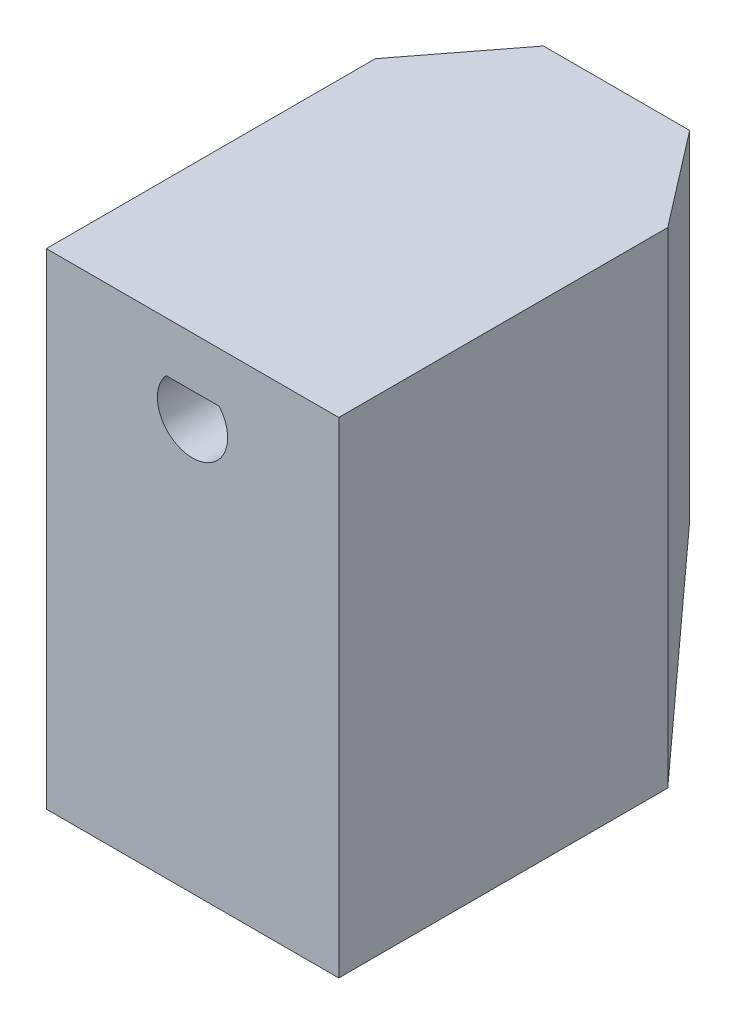
ISO-10303-21;
HEADER;
FILE_DESCRIPTION(('STEP AP214'),'2;1');
FILE_NAME('part.step','',(''),(''),'','','');
FILE_SCHEMA(('AUTOMOTIVE_DESIGN { 1 0 10303 214 1 1 1 1 }'));
ENDSEC;
DATA;
#1=APPLICATION_CONTEXT('core data for automotive mechanical design processes');
#2=APPLICATION_PROTOCOL_DEFINITION('international standard','automotive_design',2000,#1);
#3=PRODUCT_CONTEXT('',#1,'mechanical');
#4=PRODUCT('Part','Part','',(#3));
#5=PRODUCT_RELATED_PRODUCT_CATEGORY('part','',(#4));
#6=PRODUCT_DEFINITION_FORMATION('','',#4);
#7=PRODUCT_DEFINITION_CONTEXT('part definition',#1,'design');
#8=PRODUCT_DEFINITION('design','',#6,#7);
#9=PRODUCT_DEFINITION_SHAPE('','',#8);
#10=(LENGTH_UNIT() NAMED_UNIT(*) SI_UNIT(.MILLI.,.METRE.));
#11=(NAMED_UNIT(*) PLANE_ANGLE_UNIT() SI_UNIT($,.RADIAN.));
#12=(NAMED_UNIT(*) SI_UNIT($,.STERADIAN.) SOLID_ANGLE_UNIT());
#13=UNCERTAINTY_MEASURE_WITH_UNIT(LENGTH_MEASURE(1.E-05),#10,'distance_accuracy_value','');
#14=(GEOMETRIC_REPRESENTATION_CONTEXT(3) GLOBAL_UNCERTAINTY_ASSIGNED_CONTEXT((#13)) GLOBAL_UNIT_ASSIGNED_CONTEXT((#10,
#11,#12)) REPRESENTATION_CONTEXT('',''));
#15=CARTESIAN_POINT('',(0.,0.,0.));
#16=DIRECTION('',(0.,0.,1.));
#17=DIRECTION('',(1.,0.,0.));
#18=AXIS2_PLACEMENT_3D('',#15,#16,#17);
#19=CARTESIAN_POINT('',(12.7,0.,25.4));
#20=DIRECTION('',(1.,0.,0.));
#21=DIRECTION('',(0.,1.,0.));
#22=AXIS2_PLACEMENT_3D('',#19,#20,#21);
#23=PLANE('',#22);
#24=DIRECTION('',(0.,-1.,0.));
#25=VECTOR('',#24,1.);
#26=CARTESIAN_POINT('',(12.7,6.351,-3.175));
#27=LINE('',#26,#25);
#28=CARTESIAN_POINT('',(12.7,6.35,-3.175));
#29=VERTEX_POINT('',#28);
#30=CARTESIAN_POINT('',(12.7,-35.814,-3.175));
#31=VERTEX_POINT('',#30);
#32=EDGE_CURVE('E183',#29,#31,#27,.T.);
#33=ORIENTED_EDGE('',*,*,#32,.F.);
#34=DIRECTION('',(0.,0.,1.));
#35=VECTOR('',#34,1.);
#36=CARTESIAN_POINT('',(12.7,6.35,-11.43));
#37=LINE('',#36,#35);
#38=CARTESIAN_POINT('',(12.7,6.35,25.4));
#39=VERTEX_POINT('',#38);
#40=EDGE_CURVE('E59',#29,#39,#37,.T.);
#41=ORIENTED_EDGE('',*,*,#40,.T.);
#42=DIRECTION('',(0.,-1.,0.));
#43=VECTOR('',#42,1.);
#44=CARTESIAN_POINT('',(12.7,0.,25.4));
#45=LINE('',#44,#43);
#46=CARTESIAN_POINT('',(12.7,-35.814,25.4));
#47=VERTEX_POINT('',#46);
#48=EDGE_CURVE('E171',#39,#47,#45,.T.);
#49=ORIENTED_EDGE('',*,*,#48,.T.);
#50=DIRECTION('',(0.,0.,-1.));
#51=VECTOR('',#50,1.);
#52=CARTESIAN_POINT('',(12.7,-35.814,25.4));
#53=LINE('',#52,#51);
#54=EDGE_CURVE('E52',#47,#31,#53,.T.);
#55=ORIENTED_EDGE('',*,*,#54,.T.);
#56=EDGE_LOOP('',(#33,#41,#49,#55));
#57=FACE_BOUND('',#56,.T.);
#58=ADVANCED_FACE('F44',(#57),#23,.T.);
#59=CARTESIAN_POINT('',(0.,6.35,25.4));
#60=DIRECTION('',(0.,1.,0.));
#61=DIRECTION('',(-1.,0.,0.));
#62=AXIS2_PLACEMENT_3D('',#59,#60,#61);
#63=PLANE('',#62);
#64=DIRECTION('',(0.,0.,1.));
#65=VECTOR('',#64,1.);
#66=CARTESIAN_POINT('',(-12.7,6.35,-11.43));
#67=LINE('',#66,#65);
#68=CARTESIAN_POINT('',(-12.7,6.35,-3.175));
#69=VERTEX_POINT('',#68);
#70=CARTESIAN_POINT('',(-12.7,6.35,25.4));
#71=VERTEX_POINT('',#70);
#72=EDGE_CURVE('E149',#69,#71,#67,.T.);
#73=ORIENTED_EDGE('',*,*,#72,.T.);
#74=DIRECTION('',(1.,0.,0.));
#75=VECTOR('',#74,1.);
#76=CARTESIAN_POINT('',(0.,6.35,25.4));
#77=LINE('',#76,#75);
#78=EDGE_CURVE('E153',#71,#39,#77,.T.);
#79=ORIENTED_EDGE('',*,*,#78,.T.);
#80=ORIENTED_EDGE('',*,*,#40,.F.);
#81=DIRECTION('',(-0.609710760849693,0.,-0.7926239891046));
#82=VECTOR('',#81,1.);
#83=CARTESIAN_POINT('',(6.35,6.35,-11.43));
#84=LINE('',#83,#82);
#85=CARTESIAN_POINT('',(6.35,6.35,-11.43));
#86=VERTEX_POINT('',#85);
#87=EDGE_CURVE('E517',#29,#86,#84,.T.);
#88=ORIENTED_EDGE('',*,*,#87,.T.);
#89=DIRECTION('',(1.,0.,0.));
#90=VECTOR('',#89,1.);
#91=CARTESIAN_POINT('',(12.7,6.35,-11.43));
#92=LINE('',#91,#90);
#93=CARTESIAN_POINT('',(-6.35,6.35,-11.43));
#94=VERTEX_POINT('',#93);
#95=EDGE_CURVE('E193',#94,#86,#92,.T.);
#96=ORIENTED_EDGE('',*,*,#95,.F.);
#97=DIRECTION('',(-0.609710760849693,0.,0.7926239891046));
#98=VECTOR('',#97,1.);
#99=CARTESIAN_POINT('',(-12.7,6.35,-3.175));
#100=LINE('',#99,#98);
#101=EDGE_CURVE('E155',#94,#69,#100,.T.);
#102=ORIENTED_EDGE('',*,*,#101,.T.);
#103=EDGE_LOOP('',(#73,#79,#80,#88,#96,#102));
#104=FACE_BOUND('',#103,.T.);
#105=ADVANCED_FACE('F151',(#104),#63,.T.);
#106=CARTESIAN_POINT('',(-12.7,0.,25.4));
#107=DIRECTION('',(1.,0.,0.));
#108=DIRECTION('',(0.,1.,0.));
#109=AXIS2_PLACEMENT_3D('',#106,#107,#108);
#110=PLANE('',#109);
#111=ORIENTED_EDGE('',*,*,#72,.F.);
#112=DIRECTION('',(0.,-1.,0.));
#113=VECTOR('',#112,1.);
#114=CARTESIAN_POINT('',(-12.7,6.351,-3.175));
#115=LINE('',#114,#113);
#116=CARTESIAN_POINT('',(-12.7,-35.814,-3.175));
#117=VERTEX_POINT('',#116);
#118=EDGE_CURVE('E508',#69,#117,#115,.T.);
#119=ORIENTED_EDGE('',*,*,#118,.T.);
#120=DIRECTION('',(0.,0.,-1.));
#121=VECTOR('',#120,1.);
#122=CARTESIAN_POINT('',(-12.7,-35.814,25.4));
#123=LINE('',#122,#121);
#124=CARTESIAN_POINT('',(-12.7,-35.814,25.4));
#125=VERTEX_POINT('',#124);
#126=EDGE_CURVE('E13',#125,#117,#123,.T.);
#127=ORIENTED_EDGE('',*,*,#126,.F.);
#128=DIRECTION('',(0.,-1.,0.));
#129=VECTOR('',#128,1.);
#130=CARTESIAN_POINT('',(-12.7,0.,25.4));
#131=LINE('',#130,#129);
#132=EDGE_CURVE('E162',#71,#125,#131,.T.);
#133=ORIENTED_EDGE('',*,*,#132,.F.);
#134=EDGE_LOOP('',(#111,#119,#127,#133));
#135=FACE_BOUND('',#134,.T.);
#136=ADVANCED_FACE('F163',(#135),#110,.F.);
#137=CARTESIAN_POINT('',(0.,-35.814,25.4));
#138=DIRECTION('',(0.,1.,0.));
#139=DIRECTION('',(0.,0.,1.));
#140=AXIS2_PLACEMENT_3D('',#137,#138,#139);
#141=PLANE('',#140);
#142=DIRECTION('',(0.,0.,1.));
#143=VECTOR('',#142,1.);
#144=CARTESIAN_POINT('',(9.525,-35.814,22.225));
#145=LINE('',#144,#143);
#146=CARTESIAN_POINT('',(9.525,-35.814,3.175));
#147=VERTEX_POINT('',#146);
#148=CARTESIAN_POINT('',(9.525,-35.814,22.225));
#149=VERTEX_POINT('',#148);
#150=EDGE_CURVE('E455',#147,#149,#145,.T.);
#151=ORIENTED_EDGE('',*,*,#150,.F.);
#152=DIRECTION('',(1.,0.,0.));
#153=VECTOR('',#152,1.);
#154=CARTESIAN_POINT('',(-9.525,-35.814,3.175));
#155=LINE('',#154,#153);
#156=CARTESIAN_POINT('',(-9.525,-35.814,3.175));
#157=VERTEX_POINT('',#156);
#158=EDGE_CURVE('E451',#157,#147,#155,.T.);
#159=ORIENTED_EDGE('',*,*,#158,.F.);
#160=DIRECTION('',(0.,0.,-1.));
#161=VECTOR('',#160,1.);
#162=CARTESIAN_POINT('',(-9.525,-35.814,22.225));
#163=LINE('',#162,#161);
#164=CARTESIAN_POINT('',(-9.525,-35.814,22.225));
#165=VERTEX_POINT('',#164);
#166=EDGE_CURVE('E441',#165,#157,#163,.T.);
#167=ORIENTED_EDGE('',*,*,#166,.F.);
#168=DIRECTION('',(-1.,0.,0.));
#169=VECTOR('',#168,1.);
#170=CARTESIAN_POINT('',(-9.525,-35.814,22.225));
#171=LINE('',#170,#169);
#172=EDGE_CURVE('E67',#149,#165,#171,.T.);
#173=ORIENTED_EDGE('',*,*,#172,.F.);
#174=EDGE_LOOP('',(#151,#159,#167,#173));
#175=FACE_BOUND('',#174,.T.);
#176=ORIENTED_EDGE('',*,*,#126,.T.);
#177=DIRECTION('',(1.,0.,0.));
#178=VECTOR('',#177,1.);
#179=CARTESIAN_POINT('',(-14.2885,-35.814,-3.175));
#180=LINE('',#179,#178);
#181=EDGE_CURVE('E188',#117,#31,#180,.T.);
#182=ORIENTED_EDGE('',*,*,#181,.T.);
#183=ORIENTED_EDGE('',*,*,#54,.F.);
#184=DIRECTION('',(1.,0.,0.));
#185=VECTOR('',#184,1.);
#186=CARTESIAN_POINT('',(0.,-35.814,25.4));
#187=LINE('',#186,#185);
#188=EDGE_CURVE('E167',#125,#47,#187,.T.);
#189=ORIENTED_EDGE('',*,*,#188,.F.);
#190=EDGE_LOOP('',(#176,#182,#183,#189));
#191=FACE_BOUND('',#190,.T.);
#192=ADVANCED_FACE('F186',(#175,#191),#141,.F.);
#193=CARTESIAN_POINT('',(0.,0.,25.4));
#194=DIRECTION('',(0.,0.,1.));
#195=DIRECTION('',(1.,0.,0.));
#196=AXIS2_PLACEMENT_3D('',#193,#194,#195);
#197=PLANE('',#196);
#198=ORIENTED_EDGE('',*,*,#78,.F.);
#199=ORIENTED_EDGE('',*,*,#132,.T.);
#200=ORIENTED_EDGE('',*,*,#188,.T.);
#201=ORIENTED_EDGE('',*,*,#48,.F.);
#202=EDGE_LOOP('',(#198,#199,#200,#201));
#203=FACE_BOUND('',#202,.T.);
#204=CARTESIAN_POINT('',(0.,0.,25.4));
#205=DIRECTION('',(0.,0.,1.));
#206=DIRECTION('',(1.,0.,0.));
#207=AXIS2_PLACEMENT_3D('',#204,#205,#206);
#208=CIRCLE('',#207,3.05);
#209=CARTESIAN_POINT('',(-2.3,2.00312256240101,25.4));
#210=VERTEX_POINT('',#209);
#211=CARTESIAN_POINT('',(2.3,2.00312256240101,25.4));
#212=VERTEX_POINT('',#211);
#213=EDGE_CURVE('E159',#210,#212,#208,.T.);
#214=ORIENTED_EDGE('',*,*,#213,.F.);
#215=DIRECTION('',(-1.,0.,0.));
#216=VECTOR('',#215,1.);
#217=CARTESIAN_POINT('',(-2.3,2.00312256240101,25.4));
#218=LINE('',#217,#216);
#219=EDGE_CURVE('E212',#212,#210,#218,.T.);
#220=ORIENTED_EDGE('',*,*,#219,.F.);
#221=EDGE_LOOP('',(#214,#220));
#222=FACE_BOUND('',#221,.T.);
#223=ADVANCED_FACE('F169',(#203,#222),#197,.T.);
#224=CARTESIAN_POINT('',(0.,0.,15.9));
#225=DIRECTION('',(0.,0.,1.));
#226=DIRECTION('',(1.,0.,0.));
#227=AXIS2_PLACEMENT_3D('',#224,#225,#226);
#228=CYLINDRICAL_SURFACE('',#227,3.05);
#229=ORIENTED_EDGE('',*,*,#213,.T.);
#230=DIRECTION('',(0.,0.,1.));
#231=VECTOR('',#230,1.);
#232=CARTESIAN_POINT('',(2.3,2.00312256240101,15.9));
#233=LINE('',#232,#231);
#234=CARTESIAN_POINT('',(2.3,2.00312256240101,15.9));
#235=VERTEX_POINT('',#234);
#236=EDGE_CURVE('E216',#235,#212,#233,.T.);
#237=ORIENTED_EDGE('',*,*,#236,.F.);
#238=CARTESIAN_POINT('',(0.,0.,15.9));
#239=DIRECTION('',(0.,0.,1.));
#240=DIRECTION('',(1.,0.,0.));
#241=AXIS2_PLACEMENT_3D('',#238,#239,#240);
#242=CIRCLE('',#241,3.05);
#243=CARTESIAN_POINT('',(-2.3,2.00312256240101,15.9));
#244=VERTEX_POINT('',#243);
#245=EDGE_CURVE('E207',#244,#235,#242,.T.);
#246=ORIENTED_EDGE('',*,*,#245,.F.);
#247=DIRECTION('',(0.,0.,1.));
#248=VECTOR('',#247,1.);
#249=CARTESIAN_POINT('',(-2.3,2.00312256240101,15.9));
#250=LINE('',#249,#248);
#251=EDGE_CURVE('E175',#244,#210,#250,.T.);
#252=ORIENTED_EDGE('',*,*,#251,.T.);
#253=EDGE_LOOP('',(#229,#237,#246,#252));
#254=FACE_BOUND('',#253,.T.);
#255=ADVANCED_FACE('F232',(#254),#228,.F.);
#256=CARTESIAN_POINT('',(-2.3,2.00312256240101,15.9));
#257=DIRECTION('',(0.,1.,0.));
#258=DIRECTION('',(0.,0.,1.));
#259=AXIS2_PLACEMENT_3D('',#256,#257,#258);
#260=PLANE('',#259);
#261=ORIENTED_EDGE('',*,*,#219,.T.);
#262=ORIENTED_EDGE('',*,*,#251,.F.);
#263=DIRECTION('',(-1.,0.,0.));
#264=VECTOR('',#263,1.);
#265=CARTESIAN_POINT('',(-2.3,2.00312256240101,15.9));
#266=LINE('',#265,#264);
#267=EDGE_CURVE('E211',#235,#244,#266,.T.);
#268=ORIENTED_EDGE('',*,*,#267,.F.);
#269=ORIENTED_EDGE('',*,*,#236,.T.);
#270=EDGE_LOOP('',(#261,#262,#268,#269));
#271=FACE_BOUND('',#270,.T.);
#272=ADVANCED_FACE('F228',(#271),#260,.F.);
#273=CARTESIAN_POINT('',(0.,0.,15.9));
#274=DIRECTION('',(0.,0.,1.));
#275=DIRECTION('',(1.,0.,0.));
#276=AXIS2_PLACEMENT_3D('',#273,#274,#275);
#277=PLANE('',#276);
#278=ORIENTED_EDGE('',*,*,#245,.T.);
#279=ORIENTED_EDGE('',*,*,#267,.T.);
#280=EDGE_LOOP('',(#278,#279));
#281=FACE_BOUND('',#280,.T.);
#282=ADVANCED_FACE('F234',(#281),#277,.T.);
#283=CARTESIAN_POINT('',(0.,0.,-11.43));
#284=DIRECTION('',(0.,0.,-1.));
#285=DIRECTION('',(-1.,0.,0.));
#286=AXIS2_PLACEMENT_3D('',#283,#284,#285);
#287=PLANE('',#286);
#288=CARTESIAN_POINT('',(0.,0.,-11.43));
#289=DIRECTION('',(0.,0.,-1.));
#290=DIRECTION('',(-1.,0.,0.));
#291=AXIS2_PLACEMENT_3D('',#288,#289,#290);
#292=CIRCLE('',#291,3.302);
#293=CARTESIAN_POINT('',(1.651,2.85961588329622,-11.43));
#294=VERTEX_POINT('',#293);
#295=CARTESIAN_POINT('',(-1.651,2.85961588329622,-11.43));
#296=VERTEX_POINT('',#295);
#297=EDGE_CURVE('E480',#294,#296,#292,.T.);
#298=ORIENTED_EDGE('',*,*,#297,.F.);
#299=DIRECTION('',(1.,0.,0.));
#300=VECTOR('',#299,1.);
#301=CARTESIAN_POINT('',(1.651,2.85961588329622,-11.43));
#302=LINE('',#301,#300);
#303=EDGE_CURVE('E486',#296,#294,#302,.T.);
#304=ORIENTED_EDGE('',*,*,#303,.F.);
#305=EDGE_LOOP('',(#298,#304));
#306=FACE_BOUND('',#305,.T.);
#307=DIRECTION('',(0.,-1.,0.));
#308=VECTOR('',#307,1.);
#309=CARTESIAN_POINT('',(-6.35,6.351,-11.43));
#310=LINE('',#309,#308);
#311=CARTESIAN_POINT('',(-6.35,-23.01875,-11.43));
#312=VERTEX_POINT('',#311);
#313=EDGE_CURVE('E506',#94,#312,#310,.T.);
#314=ORIENTED_EDGE('',*,*,#313,.F.);
#315=ORIENTED_EDGE('',*,*,#95,.T.);
#316=DIRECTION('',(0.,-1.,0.));
#317=VECTOR('',#316,1.);
#318=CARTESIAN_POINT('',(6.35,6.351,-11.43));
#319=LINE('',#318,#317);
#320=CARTESIAN_POINT('',(6.35,-23.01875,-11.43));
#321=VERTEX_POINT('',#320);
#322=EDGE_CURVE('E507',#86,#321,#319,.T.);
#323=ORIENTED_EDGE('',*,*,#322,.T.);
#324=DIRECTION('',(1.,0.,0.));
#325=VECTOR('',#324,1.);
#326=CARTESIAN_POINT('',(-14.2885,-23.01875,-11.43));
#327=LINE('',#326,#325);
#328=EDGE_CURVE('E194',#312,#321,#327,.T.);
#329=ORIENTED_EDGE('',*,*,#328,.F.);
#330=EDGE_LOOP('',(#314,#315,#323,#329));
#331=FACE_BOUND('',#330,.T.);
#332=ADVANCED_FACE('F236',(#306,#331),#287,.T.);
#333=CARTESIAN_POINT('',(-14.2885,-35.814,-3.175));
#334=DIRECTION('',(0.,0.542126869822093,0.840296648224244));
#335=DIRECTION('',(0.,-0.840296648224244,0.542126869822093));
#336=AXIS2_PLACEMENT_3D('',#333,#334,#335);
#337=PLANE('',#336);
#338=ORIENTED_EDGE('',*,*,#181,.F.);
#339=DIRECTION('',(-0.38489376461713,-0.775560935703517,0.500361894002269));
#340=VECTOR('',#339,1.);
#341=CARTESIAN_POINT('',(-0.113386220459314,-10.4519732342255,-19.5375979134029));
#342=LINE('',#341,#340);
#343=EDGE_CURVE('E503',#312,#117,#342,.T.);
#344=ORIENTED_EDGE('',*,*,#343,.F.);
#345=ORIENTED_EDGE('',*,*,#328,.T.);
#346=DIRECTION('',(-0.384893764617131,0.775560935703517,-0.500361894002269));
#347=VECTOR('',#346,1.);
#348=CARTESIAN_POINT('',(-2.41712202185854,-5.35299912595507,-22.8272586284161));
#349=LINE('',#348,#347);
#350=EDGE_CURVE('E499',#31,#321,#349,.T.);
#351=ORIENTED_EDGE('',*,*,#350,.F.);
#352=EDGE_LOOP('',(#338,#344,#345,#351));
#353=FACE_BOUND('',#352,.T.);
#354=ADVANCED_FACE('F242',(#353),#337,.F.);
#355=CARTESIAN_POINT('',(6.35,6.351,-11.43));
#356=DIRECTION('',(-0.7926239891046,0.,0.609710760849693));
#357=DIRECTION('',(0.609710760849693,0.,0.7926239891046));
#358=AXIS2_PLACEMENT_3D('',#355,#356,#357);
#359=PLANE('',#358);
#360=ORIENTED_EDGE('',*,*,#32,.T.);
#361=ORIENTED_EDGE('',*,*,#350,.T.);
#362=ORIENTED_EDGE('',*,*,#322,.F.);
#363=ORIENTED_EDGE('',*,*,#87,.F.);
#364=EDGE_LOOP('',(#360,#361,#362,#363));
#365=FACE_BOUND('',#364,.T.);
#366=ADVANCED_FACE('F283',(#365),#359,.F.);
#367=CARTESIAN_POINT('',(-12.7,6.351,-3.175));
#368=DIRECTION('',(0.7926239891046,0.,0.609710760849693));
#369=DIRECTION('',(0.609710760849693,0.,-0.7926239891046));
#370=AXIS2_PLACEMENT_3D('',#367,#368,#369);
#371=PLANE('',#370);
#372=ORIENTED_EDGE('',*,*,#313,.T.);
#373=ORIENTED_EDGE('',*,*,#343,.T.);
#374=ORIENTED_EDGE('',*,*,#118,.F.);
#375=ORIENTED_EDGE('',*,*,#101,.F.);
#376=EDGE_LOOP('',(#372,#373,#374,#375));
#377=FACE_BOUND('',#376,.T.);
#378=ADVANCED_FACE('F293',(#377),#371,.F.);
#379=CARTESIAN_POINT('',(0.,0.,8.57));
#380=DIRECTION('',(0.,0.,-1.));
#381=DIRECTION('',(-1.,0.,0.));
#382=AXIS2_PLACEMENT_3D('',#379,#380,#381);
#383=CYLINDRICAL_SURFACE('',#382,3.302);
#384=ORIENTED_EDGE('',*,*,#297,.T.);
#385=DIRECTION('',(0.,0.,-1.));
#386=VECTOR('',#385,1.);
#387=CARTESIAN_POINT('',(-1.651,2.85961588329622,8.57));
#388=LINE('',#387,#386);
#389=CARTESIAN_POINT('',(-1.651,2.85961588329622,8.57));
#390=VERTEX_POINT('',#389);
#391=EDGE_CURVE('E490',#390,#296,#388,.T.);
#392=ORIENTED_EDGE('',*,*,#391,.F.);
#393=CARTESIAN_POINT('',(0.,0.,8.57));
#394=DIRECTION('',(0.,0.,-1.));
#395=DIRECTION('',(-1.,0.,0.));
#396=AXIS2_PLACEMENT_3D('',#393,#394,#395);
#397=CIRCLE('',#396,3.302);
#398=CARTESIAN_POINT('',(1.651,2.85961588329622,8.57));
#399=VERTEX_POINT('',#398);
#400=EDGE_CURVE('E481',#399,#390,#397,.T.);
#401=ORIENTED_EDGE('',*,*,#400,.F.);
#402=DIRECTION('',(0.,0.,-1.));
#403=VECTOR('',#402,1.);
#404=CARTESIAN_POINT('',(1.651,2.85961588329622,8.57));
#405=LINE('',#404,#403);
#406=EDGE_CURVE('E496',#399,#294,#405,.T.);
#407=ORIENTED_EDGE('',*,*,#406,.T.);
#408=EDGE_LOOP('',(#384,#392,#401,#407));
#409=FACE_BOUND('',#408,.T.);
#410=ADVANCED_FACE('F303',(#409),#383,.F.);
#411=CARTESIAN_POINT('',(1.651,2.85961588329622,8.57));
#412=DIRECTION('',(0.,1.,0.));
#413=DIRECTION('',(0.,0.,1.));
#414=AXIS2_PLACEMENT_3D('',#411,#412,#413);
#415=PLANE('',#414);
#416=ORIENTED_EDGE('',*,*,#303,.T.);
#417=ORIENTED_EDGE('',*,*,#406,.F.);
#418=DIRECTION('',(1.,0.,0.));
#419=VECTOR('',#418,1.);
#420=CARTESIAN_POINT('',(1.651,2.85961588329622,8.57));
#421=LINE('',#420,#419);
#422=EDGE_CURVE('E485',#390,#399,#421,.T.);
#423=ORIENTED_EDGE('',*,*,#422,.F.);
#424=ORIENTED_EDGE('',*,*,#391,.T.);
#425=EDGE_LOOP('',(#416,#417,#423,#424));
#426=FACE_BOUND('',#425,.T.);
#427=ADVANCED_FACE('F319',(#426),#415,.F.);
#428=CARTESIAN_POINT('',(0.,0.,8.57));
#429=DIRECTION('',(0.,0.,-1.));
#430=DIRECTION('',(-1.,0.,0.));
#431=AXIS2_PLACEMENT_3D('',#428,#429,#430);
#432=PLANE('',#431);
#433=ORIENTED_EDGE('',*,*,#400,.T.);
#434=ORIENTED_EDGE('',*,*,#422,.T.);
#435=EDGE_LOOP('',(#433,#434));
#436=FACE_BOUND('',#435,.T.);
#437=ADVANCED_FACE('F329',(#436),#432,.T.);
#438=CARTESIAN_POINT('',(0.,-9.52499999999996,25.4));
#439=DIRECTION('',(0.,1.,0.));
#440=DIRECTION('',(-1.,0.,0.));
#441=AXIS2_PLACEMENT_3D('',#438,#439,#440);
#442=PLANE('',#441);
#443=DIRECTION('',(0.,0.,-1.));
#444=VECTOR('',#443,1.);
#445=CARTESIAN_POINT('',(-9.525,-9.52499999999993,22.225));
#446=LINE('',#445,#444);
#447=CARTESIAN_POINT('',(-9.525,-9.52499999999993,22.225));
#448=VERTEX_POINT('',#447);
#449=CARTESIAN_POINT('',(-9.525,-9.52499999999993,3.175));
#450=VERTEX_POINT('',#449);
#451=EDGE_CURVE('E444',#448,#450,#446,.T.);
#452=ORIENTED_EDGE('',*,*,#451,.T.);
#453=DIRECTION('',(1.,0.,0.));
#454=VECTOR('',#453,1.);
#455=CARTESIAN_POINT('',(-9.5250000000001,-9.52499999999993,3.175));
#456=LINE('',#455,#454);
#457=CARTESIAN_POINT('',(9.525,-9.52499999999996,3.175));
#458=VERTEX_POINT('',#457);
#459=EDGE_CURVE('E459',#450,#458,#456,.T.);
#460=ORIENTED_EDGE('',*,*,#459,.T.);
#461=DIRECTION('',(0.,0.,1.));
#462=VECTOR('',#461,1.);
#463=CARTESIAN_POINT('',(9.525,-9.52499999999999,22.225));
#464=LINE('',#463,#462);
#465=CARTESIAN_POINT('',(9.525,-9.52499999999999,22.225));
#466=VERTEX_POINT('',#465);
#467=EDGE_CURVE('E470',#458,#466,#464,.T.);
#468=ORIENTED_EDGE('',*,*,#467,.T.);
#469=DIRECTION('',(-1.,0.,0.));
#470=VECTOR('',#469,1.);
#471=CARTESIAN_POINT('',(-9.5250000000001,-9.52499999999993,22.225));
#472=LINE('',#471,#470);
#473=EDGE_CURVE('E447',#466,#448,#472,.T.);
#474=ORIENTED_EDGE('',*,*,#473,.T.);
#475=EDGE_LOOP('',(#452,#460,#468,#474));
#476=FACE_BOUND('',#475,.T.);
#477=ADVANCED_FACE('F339',(#476),#442,.F.);
#478=CARTESIAN_POINT('',(-9.525,20.5907683632075,3.175));
#479=DIRECTION('',(0.,0.,-1.));
#480=DIRECTION('',(-1.,0.,0.));
#481=AXIS2_PLACEMENT_3D('',#478,#479,#480);
#482=PLANE('',#481);
#483=DIRECTION('',(0.,-1.,0.));
#484=VECTOR('',#483,1.);
#485=CARTESIAN_POINT('',(-9.525,20.5907683632075,3.175));
#486=LINE('',#485,#484);
#487=EDGE_CURVE('E466',#450,#157,#486,.T.);
#488=ORIENTED_EDGE('',*,*,#487,.T.);
#489=ORIENTED_EDGE('',*,*,#158,.T.);
#490=DIRECTION('',(0.,-1.,0.));
#491=VECTOR('',#490,1.);
#492=CARTESIAN_POINT('',(9.525,20.5907683632075,3.175));
#493=LINE('',#492,#491);
#494=EDGE_CURVE('E463',#458,#147,#493,.T.);
#495=ORIENTED_EDGE('',*,*,#494,.F.);
#496=ORIENTED_EDGE('',*,*,#459,.F.);
#497=EDGE_LOOP('',(#488,#489,#495,#496));
#498=FACE_BOUND('',#497,.T.);
#499=ADVANCED_FACE('F356',(#498),#482,.F.);
#500=CARTESIAN_POINT('',(9.525,20.5907683632075,22.225));
#501=DIRECTION('',(1.,0.,0.));
#502=DIRECTION('',(0.,0.,-1.));
#503=AXIS2_PLACEMENT_3D('',#500,#501,#502);
#504=PLANE('',#503);
#505=ORIENTED_EDGE('',*,*,#494,.T.);
#506=ORIENTED_EDGE('',*,*,#150,.T.);
#507=DIRECTION('',(0.,-1.,0.));
#508=VECTOR('',#507,1.);
#509=CARTESIAN_POINT('',(9.525,20.5907683632075,22.225));
#510=LINE('',#509,#508);
#511=EDGE_CURVE('E469',#466,#149,#510,.T.);
#512=ORIENTED_EDGE('',*,*,#511,.F.);
#513=ORIENTED_EDGE('',*,*,#467,.F.);
#514=EDGE_LOOP('',(#505,#506,#512,#513));
#515=FACE_BOUND('',#514,.T.);
#516=ADVANCED_FACE('F366',(#515),#504,.F.);
#517=CARTESIAN_POINT('',(-9.525,20.5907683632075,22.225));
#518=DIRECTION('',(0.,0.,1.));
#519=DIRECTION('',(1.,0.,0.));
#520=AXIS2_PLACEMENT_3D('',#517,#518,#519);
#521=PLANE('',#520);
#522=ORIENTED_EDGE('',*,*,#511,.T.);
#523=ORIENTED_EDGE('',*,*,#172,.T.);
#524=DIRECTION('',(0.,-1.,0.));
#525=VECTOR('',#524,1.);
#526=CARTESIAN_POINT('',(-9.525,20.5907683632075,22.225));
#527=LINE('',#526,#525);
#528=EDGE_CURVE('E438',#448,#165,#527,.T.);
#529=ORIENTED_EDGE('',*,*,#528,.F.);
#530=ORIENTED_EDGE('',*,*,#473,.F.);
#531=EDGE_LOOP('',(#522,#523,#529,#530));
#532=FACE_BOUND('',#531,.T.);
#533=ADVANCED_FACE('F376',(#532),#521,.F.);
#534=CARTESIAN_POINT('',(-9.525,20.5907683632075,22.225));
#535=DIRECTION('',(-1.,0.,0.));
#536=DIRECTION('',(0.,0.,1.));
#537=AXIS2_PLACEMENT_3D('',#534,#535,#536);
#538=PLANE('',#537);
#539=ORIENTED_EDGE('',*,*,#528,.T.);
#540=ORIENTED_EDGE('',*,*,#166,.T.);
#541=ORIENTED_EDGE('',*,*,#487,.F.);
#542=ORIENTED_EDGE('',*,*,#451,.F.);
#543=EDGE_LOOP('',(#539,#540,#541,#542));
#544=FACE_BOUND('',#543,.T.);
#545=ADVANCED_FACE('F386',(#544),#538,.F.);
#546=CLOSED_SHELL('',(#58,#105,#136,#192,#223,#255,#272,#282,#332,#354,#366,#378,#410,#427,#437,
#477,#499,#516,#533,#545));
#547=MANIFOLD_SOLID_BREP('B2',#546);
#548=ADVANCED_BREP_SHAPE_REPRESENTATION('',(#18,#547),#14);
#549=SHAPE_DEFINITION_REPRESENTATION(#9,#548);
ENDSEC;
END-ISO-10303-21;
